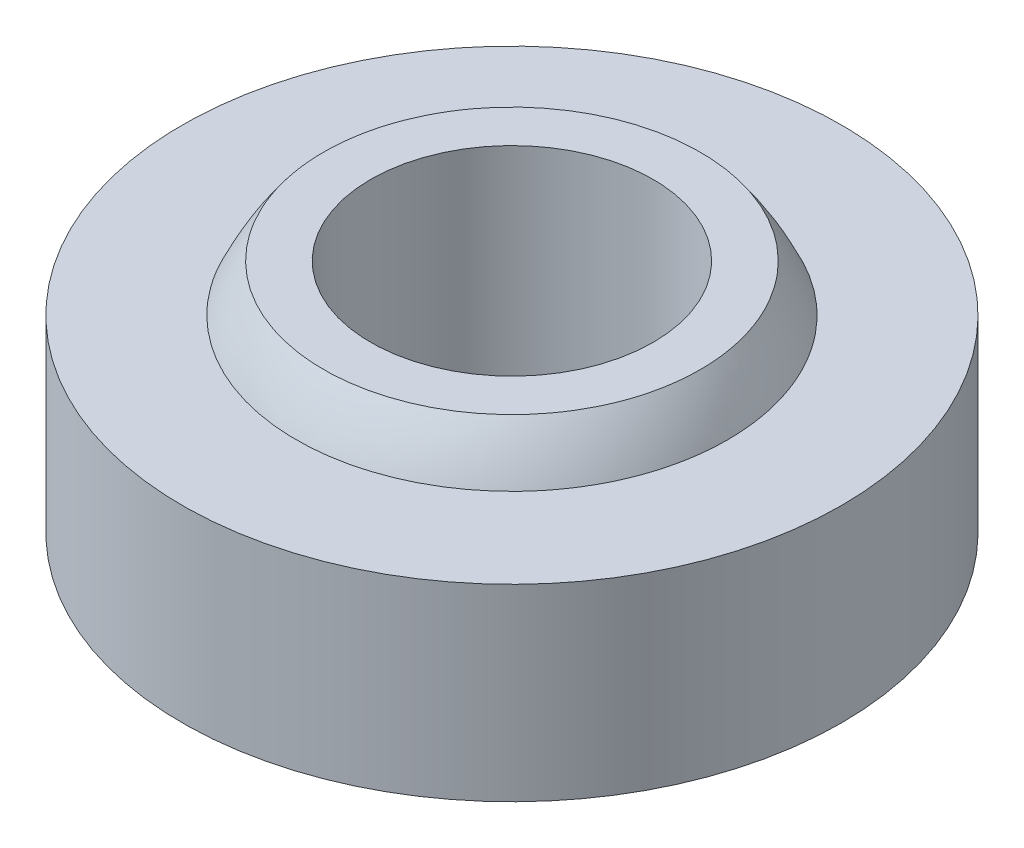
ISO-10303-21;
HEADER;
FILE_DESCRIPTION(('STEP AP214'),'2;1');
FILE_NAME('part.step','',(''),(''),'','','');
FILE_SCHEMA(('AUTOMOTIVE_DESIGN { 1 0 10303 214 1 1 1 1 }'));
ENDSEC;
DATA;
#1=APPLICATION_CONTEXT('core data for automotive mechanical design processes');
#2=APPLICATION_PROTOCOL_DEFINITION('international standard','automotive_design',2000,#1);
#3=PRODUCT_CONTEXT('',#1,'mechanical');
#4=PRODUCT('Part','Part','',(#3));
#5=PRODUCT_RELATED_PRODUCT_CATEGORY('part','',(#4));
#6=PRODUCT_DEFINITION_FORMATION('','',#4);
#7=PRODUCT_DEFINITION_CONTEXT('part definition',#1,'design');
#8=PRODUCT_DEFINITION('design','',#6,#7);
#9=PRODUCT_DEFINITION_SHAPE('','',#8);
#10=(LENGTH_UNIT() NAMED_UNIT(*) SI_UNIT(.MILLI.,.METRE.));
#11=(NAMED_UNIT(*) PLANE_ANGLE_UNIT() SI_UNIT($,.RADIAN.));
#12=(NAMED_UNIT(*) SI_UNIT($,.STERADIAN.) SOLID_ANGLE_UNIT());
#13=UNCERTAINTY_MEASURE_WITH_UNIT(LENGTH_MEASURE(1.E-05),#10,'distance_accuracy_value','');
#14=(GEOMETRIC_REPRESENTATION_CONTEXT(3) GLOBAL_UNCERTAINTY_ASSIGNED_CONTEXT((#13)) GLOBAL_UNIT_ASSIGNED_CONTEXT((#10,
#11,#12)) REPRESENTATION_CONTEXT('',''));
#15=CARTESIAN_POINT('',(0.,0.,0.));
#16=DIRECTION('',(0.,0.,1.));
#17=DIRECTION('',(1.,0.,0.));
#18=AXIS2_PLACEMENT_3D('',#15,#16,#17);
#19=CARTESIAN_POINT('',(0.,0.,0.));
#20=DIRECTION('',(0.,-1.,0.));
#21=DIRECTION('',(1.,0.,0.));
#22=AXIS2_PLACEMENT_3D('',#19,#20,#21);
#23=CYLINDRICAL_SURFACE('',#22,3.);
#24=CARTESIAN_POINT('',(0.,-3.,0.));
#25=DIRECTION('',(0.,-1.,0.));
#26=DIRECTION('',(1.,0.,0.));
#27=AXIS2_PLACEMENT_3D('',#24,#25,#26);
#28=CIRCLE('',#27,3.);
#29=CARTESIAN_POINT('',(3.,-3.,0.));
#30=VERTEX_POINT('',#29);
#31=EDGE_CURVE('E18',#30,#30,#28,.F.);
#32=ORIENTED_EDGE('',*,*,#31,.F.);
#33=EDGE_LOOP('',(#32));
#34=FACE_BOUND('',#33,.T.);
#35=CARTESIAN_POINT('',(0.,3.,0.));
#36=DIRECTION('',(0.,-1.,0.));
#37=DIRECTION('',(1.,0.,0.));
#38=AXIS2_PLACEMENT_3D('',#35,#36,#37);
#39=CIRCLE('',#38,3.);
#40=CARTESIAN_POINT('',(3.,3.,0.));
#41=VERTEX_POINT('',#40);
#42=EDGE_CURVE('E119',#41,#41,#39,.T.);
#43=ORIENTED_EDGE('',*,*,#42,.F.);
#44=EDGE_LOOP('',(#43));
#45=FACE_BOUND('',#44,.T.);
#46=ADVANCED_FACE('F15',(#34,#45),#23,.F.);
#47=CARTESIAN_POINT('',(3.5,-3.,0.));
#48=DIRECTION('',(0.,-1.,0.));
#49=DIRECTION('',(0.,0.,-1.));
#50=AXIS2_PLACEMENT_3D('',#47,#48,#49);
#51=PLANE('',#50);
#52=ORIENTED_EDGE('',*,*,#31,.T.);
#53=EDGE_LOOP('',(#52));
#54=FACE_BOUND('',#53,.T.);
#55=CARTESIAN_POINT('',(4.,-3.,0.));
#56=CARTESIAN_POINT('',(3.99999003661802,-3.,-0.224681767866029));
#57=CARTESIAN_POINT('',(3.98100576774657,-3.,-0.449526451187646));
#58=CARTESIAN_POINT('',(3.90553719844646,-3.,-0.893023453588219));
#59=CARTESIAN_POINT('',(3.84900776494289,-3.,-1.11166798922419));
#60=CARTESIAN_POINT('',(3.70005812836991,-3.,-1.53627539609878));
#61=CARTESIAN_POINT('',(3.60765506641119,-3.,-1.74224426964138));
#62=CARTESIAN_POINT('',(3.38960470170985,-3.,-2.13568761944987));
#63=CARTESIAN_POINT('',(3.26396566535881,-3.,-2.32316667857358));
#64=CARTESIAN_POINT('',(2.98298441438644,-3.,-2.67439419660804));
#65=CARTESIAN_POINT('',(2.82763909297667,-3.,-2.83814017027712));
#66=CARTESIAN_POINT('',(2.49165659254897,-3.,-3.13723374355396));
#67=CARTESIAN_POINT('',(2.31101842078934,-3.,-3.27258022796353));
#68=CARTESIAN_POINT('',(1.92958645723381,-3.,-3.51102281676963));
#69=CARTESIAN_POINT('',(1.72879304088476,-3.,-3.61411952175976));
#70=CARTESIAN_POINT('',(1.31274812032906,-3.,-3.78513904681603));
#71=CARTESIAN_POINT('',(1.09749664519565,-2.99999999999999,-3.85306193760967));
#72=CARTESIAN_POINT('',(0.658645177224154,-2.99999999999999,-3.95180615221405));
#73=CARTESIAN_POINT('',(0.43504516847158,-3.,-3.98262740529569));
#74=CARTESIAN_POINT('',(-0.0141552150189684,-3.,-4.00629315051678));
#75=CARTESIAN_POINT('',(-0.239755586151758,-3.,-3.99913771108644));
#76=CARTESIAN_POINT('',(-0.686553057770722,-3.,-3.94705334477137));
#77=CARTESIAN_POINT('',(-0.9077501566138,-3.,-3.90212440379159));
#78=CARTESIAN_POINT('',(-1.33946209637271,-3.,-3.77576834682869));
#79=CARTESIAN_POINT('',(-1.54997692601201,-3.,-3.69434119231781));
#80=CARTESIAN_POINT('',(-1.95434810659038,-3.,-3.49730021044113));
#81=CARTESIAN_POINT('',(-2.14820446295044,-3.,-3.38168639420039));
#82=CARTESIAN_POINT('',(-2.51375568569413,-3.,-3.11955406993029));
#83=CARTESIAN_POINT('',(-2.68545056104795,-3.,-2.97303557441012));
#84=CARTESIAN_POINT('',(-3.00180502498551,-3.,-2.65325306901473));
#85=CARTESIAN_POINT('',(-3.14646460986428,-3.,-2.47998905547426));
#86=CARTESIAN_POINT('',(-3.40464202073755,-3.,-2.11163395980966));
#87=CARTESIAN_POINT('',(-3.51815984266235,-3.,-1.91654287483311));
#88=CARTESIAN_POINT('',(-3.71083126079983,-3.,-1.51007172649937));
#89=CARTESIAN_POINT('',(-3.78998485848385,-3.,-1.29869166383962));
#90=CARTESIAN_POINT('',(-3.91168089449035,-3.,-0.865643021338417));
#91=CARTESIAN_POINT('',(-3.9542233344622,-3.,-0.643974441960473));
#92=CARTESIAN_POINT('',(-4.00148940636231,-3.,-0.196641276119343));
#93=CARTESIAN_POINT('',(-4.00621303829057,-3.,0.0290233103438434));
#94=CARTESIAN_POINT('',(-3.97770740343691,-3.,0.477942546658597));
#95=CARTESIAN_POINT('',(-3.94447813494518,-3.,0.701197196401595));
#96=CARTESIAN_POINT('',(-3.84100997549718,-3.,1.13895901494599));
#97=CARTESIAN_POINT('',(-3.7707710829563,-3.,1.35346618337285));
#98=CARTESIAN_POINT('',(-3.5952775618736,-3.,1.76764377335726));
#99=CARTESIAN_POINT('',(-3.49002293790773,-3.,1.96731419685372));
#100=CARTESIAN_POINT('',(-3.24748583733944,-3.,2.34615024642939));
#101=CARTESIAN_POINT('',(-3.11020336512616,-3.,2.5253158753186));
#102=CARTESIAN_POINT('',(-2.80750754285971,-3.,2.85805645153241));
#103=CARTESIAN_POINT('',(-2.64209418142014,-3.,3.01163138849873));
#104=CARTESIAN_POINT('',(-2.28783216212247,-3.,3.28883099510811));
#105=CARTESIAN_POINT('',(-2.09898349663805,-3.00000000000001,3.41245565500472));
#106=CARTESIAN_POINT('',(-1.70321198561587,-2.99999999999999,3.62624518497478));
#107=CARTESIAN_POINT('',(-1.49628915915757,-2.99999999999996,3.71641009036852));
#108=CARTESIAN_POINT('',(-1.07024315957484,-2.99999999999996,3.86072075559839));
#109=CARTESIAN_POINT('',(-0.851119991002951,-2.99999999999999,3.91486652887491));
#110=CARTESIAN_POINT('',(-0.406893084983804,-3.00000000000001,3.98560200790483));
#111=CARTESIAN_POINT('',(-0.18178933676085,-3.,4.00219164598567));
#112=CARTESIAN_POINT('',(0.268007871600364,-2.99999999999999,3.99734373828826));
#113=CARTESIAN_POINT('',(0.49270133251996,-3.,3.97590626500322));
#114=CARTESIAN_POINT('',(0.935300471262957,-3.,3.89561270203184));
#115=CARTESIAN_POINT('',(1.15320613543649,-3.,3.8367565371038));
#116=CARTESIAN_POINT('',(1.57604743444956,-3.,3.68329498873638));
#117=CARTESIAN_POINT('',(1.78098282765137,-3.,3.58868893950107));
#118=CARTESIAN_POINT('',(2.17205377570359,-3.,3.3664172144466));
#119=CARTESIAN_POINT('',(2.35819006830778,-3.,3.23875283667305));
#120=CARTESIAN_POINT('',(2.70636982413492,-3.,2.95400366555082));
#121=CARTESIAN_POINT('',(2.86841580614917,-3.,2.79692195185324));
#122=CARTESIAN_POINT('',(3.1638770460916,-3.,2.45773721347813));
#123=CARTESIAN_POINT('',(3.29728517794337,-3.,2.27562797954537));
#124=CARTESIAN_POINT('',(3.53168458834207,-3.,1.89152596104933));
#125=CARTESIAN_POINT('',(3.63266035871882,-3.,1.68952372439705));
#126=CARTESIAN_POINT('',(3.79914908224812,-3.,1.27159238909413));
#127=CARTESIAN_POINT('',(3.86470454516586,-3.,1.05568033439541));
#128=CARTESIAN_POINT('',(3.94101977883139,-3.,0.698660219581047));
#129=CARTESIAN_POINT('',(3.96310975859038,-3.,0.559871996412039));
#130=CARTESIAN_POINT('',(3.99260298223412,-3.,0.280743721667774));
#131=CARTESIAN_POINT('',(4.00000622611888,-3.,0.140403670092518));
#132=CARTESIAN_POINT('',(4.,-3.,0.));
#133=B_SPLINE_CURVE_WITH_KNOTS('',3,(#55,#56,#57,#58,#59,#60,#61,#62,#63,#64,#65,#66,#67,#68,
#69,#70,#71,#72,#73,#74,#75,#76,#77,#78,#79,#80,#81,#82,#83,#84,#85,#86,#87,#88,#89,#90,#91,#92,
#93,#94,#95,#96,#97,#98,#99,#100,#101,#102,#103,#104,#105,#106,#107,#108,#109,#110,#111,#112,
#113,#114,#115,#116,#117,#118,#119,#120,#121,#122,#123,#124,#125,#126,#127,#128,#129,#130,#131,
#132),.UNSPECIFIED.,.T.,.F.,(4,2,2,2,2,2,2,2,2,2,2,2,2,2,2,2,2,2,2,2,2,2,2,2,2,2,2,2,2,2,2,2,2,
2,2,2,2,2,4),(0.,0.673532830496009,1.34787678436072,2.02189891947999,2.69575357039147,
3.36967873398819,4.04363035649474,4.71756942712821,5.39150714259985,6.06544614283765,
6.73938392870499,7.41332196604992,8.08726071481011,8.76119924425646,9.43513750091524,
10.1090758499316,10.7830142870204,11.4569526952537,12.1308910731255,12.8048294509973,
13.4787678592306,14.1527062963194,14.8266446453357,15.5005829019945,16.1745214314409,
16.848460180201,17.5223982175459,18.1963360034133,18.8702750036511,19.5442127191228,
20.2181517897562,20.8921034122628,21.5660285758595,22.239883226771,22.9139053618903,
23.588249315755,24.261782146251,24.682672912011,25.103563677771),.UNSPECIFIED.);
#134=CARTESIAN_POINT('',(4.,-3.,0.));
#135=VERTEX_POINT('',#134);
#136=EDGE_CURVE('E120',#135,#135,#133,.T.);
#137=ORIENTED_EDGE('',*,*,#136,.F.);
#138=EDGE_LOOP('',(#137));
#139=FACE_BOUND('',#138,.T.);
#140=ADVANCED_FACE('F99',(#54,#139),#51,.T.);
#141=CARTESIAN_POINT('',(3.5,3.,0.));
#142=DIRECTION('',(0.,1.,0.));
#143=DIRECTION('',(0.,0.,1.));
#144=AXIS2_PLACEMENT_3D('',#141,#142,#143);
#145=PLANE('',#144);
#146=ORIENTED_EDGE('',*,*,#42,.T.);
#147=EDGE_LOOP('',(#146));
#148=FACE_BOUND('',#147,.T.);
#149=CARTESIAN_POINT('',(4.,3.,0.));
#150=CARTESIAN_POINT('',(3.99999003661802,3.,0.22468176786603));
#151=CARTESIAN_POINT('',(3.98100576774657,3.,0.449526451187646));
#152=CARTESIAN_POINT('',(3.90553719844646,3.,0.893023453588219));
#153=CARTESIAN_POINT('',(3.84900776494289,3.,1.11166798922419));
#154=CARTESIAN_POINT('',(3.70005812836991,3.,1.53627539609878));
#155=CARTESIAN_POINT('',(3.60765506641119,3.,1.74224426964138));
#156=CARTESIAN_POINT('',(3.38960470170985,3.,2.13568761944987));
#157=CARTESIAN_POINT('',(3.26396566535881,3.,2.32316667857358));
#158=CARTESIAN_POINT('',(2.98298441438643,3.,2.67439419660804));
#159=CARTESIAN_POINT('',(2.82763909297667,3.,2.83814017027712));
#160=CARTESIAN_POINT('',(2.49165659254897,3.,3.13723374355396));
#161=CARTESIAN_POINT('',(2.31101842078934,3.,3.27258022796353));
#162=CARTESIAN_POINT('',(1.92958645723381,3.,3.51102281676963));
#163=CARTESIAN_POINT('',(1.72879304088476,3.,3.61411952175976));
#164=CARTESIAN_POINT('',(1.31274812032905,3.,3.78513904681603));
#165=CARTESIAN_POINT('',(1.09749664519565,2.99999999999998,3.85306193760968));
#166=CARTESIAN_POINT('',(0.658645177224153,2.99999999999998,3.95180615221405));
#167=CARTESIAN_POINT('',(0.435045168471579,3.,3.98262740529569));
#168=CARTESIAN_POINT('',(-0.014155215018969,3.,4.00629315051678));
#169=CARTESIAN_POINT('',(-0.239755586151758,3.,3.99913771108644));
#170=CARTESIAN_POINT('',(-0.686553057770722,3.,3.94705334477138));
#171=CARTESIAN_POINT('',(-0.907750156613799,3.,3.90212440379159));
#172=CARTESIAN_POINT('',(-1.33946209637271,3.,3.77576834682869));
#173=CARTESIAN_POINT('',(-1.54997692601201,3.,3.69434119231781));
#174=CARTESIAN_POINT('',(-1.95434810659038,3.,3.49730021044113));
#175=CARTESIAN_POINT('',(-2.14820446295044,3.,3.38168639420039));
#176=CARTESIAN_POINT('',(-2.51375568569413,3.,3.11955406993029));
#177=CARTESIAN_POINT('',(-2.68545056104795,3.,2.97303557441012));
#178=CARTESIAN_POINT('',(-3.00180502498551,3.,2.65325306901473));
#179=CARTESIAN_POINT('',(-3.14646460986428,3.,2.47998905547426));
#180=CARTESIAN_POINT('',(-3.40464202073755,3.,2.11163395980966));
#181=CARTESIAN_POINT('',(-3.51815984266235,3.,1.91654287483311));
#182=CARTESIAN_POINT('',(-3.71083126079983,3.,1.51007172649937));
#183=CARTESIAN_POINT('',(-3.78998485848385,3.,1.29869166383962));
#184=CARTESIAN_POINT('',(-3.91168089449035,3.,0.865643021338417));
#185=CARTESIAN_POINT('',(-3.9542233344622,3.,0.643974441960473));
#186=CARTESIAN_POINT('',(-4.00148940636231,3.,0.196641276119343));
#187=CARTESIAN_POINT('',(-4.00621303829057,3.,-0.0290233103438435));
#188=CARTESIAN_POINT('',(-3.97770740343691,3.,-0.477942546658598));
#189=CARTESIAN_POINT('',(-3.94447813494518,3.,-0.701197196401595));
#190=CARTESIAN_POINT('',(-3.84100997549718,3.,-1.13895901494599));
#191=CARTESIAN_POINT('',(-3.7707710829563,3.,-1.35346618337285));
#192=CARTESIAN_POINT('',(-3.5952775618736,3.,-1.76764377335726));
#193=CARTESIAN_POINT('',(-3.49002293790773,3.,-1.96731419685372));
#194=CARTESIAN_POINT('',(-3.24748583733944,3.,-2.34615024642939));
#195=CARTESIAN_POINT('',(-3.11020336512615,3.,-2.52531587531861));
#196=CARTESIAN_POINT('',(-2.80750754285971,3.,-2.85805645153241));
#197=CARTESIAN_POINT('',(-2.64209418142014,3.,-3.01163138849873));
#198=CARTESIAN_POINT('',(-2.28783216212247,3.,-3.28883099510811));
#199=CARTESIAN_POINT('',(-2.09898349663805,3.00000000000001,-3.41245565500472));
#200=CARTESIAN_POINT('',(-1.70321198561587,2.99999999999999,-3.62624518497478));
#201=CARTESIAN_POINT('',(-1.49628915915757,2.99999999999996,-3.71641009036852));
#202=CARTESIAN_POINT('',(-1.07024315957484,2.99999999999996,-3.86072075559839));
#203=CARTESIAN_POINT('',(-0.85111999100295,2.99999999999999,-3.91486652887491));
#204=CARTESIAN_POINT('',(-0.406893084983804,3.00000000000001,-3.98560200790483));
#205=CARTESIAN_POINT('',(-0.181789336760851,3.,-4.00219164598567));
#206=CARTESIAN_POINT('',(0.268007871600364,2.99999999999999,-3.99734373828826));
#207=CARTESIAN_POINT('',(0.492701332519961,3.,-3.97590626500322));
#208=CARTESIAN_POINT('',(0.935300471262957,3.,-3.89561270203184));
#209=CARTESIAN_POINT('',(1.15320613543649,3.,-3.83675653710379));
#210=CARTESIAN_POINT('',(1.57604743444956,3.,-3.68329498873638));
#211=CARTESIAN_POINT('',(1.78098282765137,3.,-3.58868893950107));
#212=CARTESIAN_POINT('',(2.17205377570359,3.,-3.3664172144466));
#213=CARTESIAN_POINT('',(2.35819006830778,3.,-3.23875283667305));
#214=CARTESIAN_POINT('',(2.70636982413492,3.,-2.95400366555082));
#215=CARTESIAN_POINT('',(2.86841580614917,3.,-2.79692195185325));
#216=CARTESIAN_POINT('',(3.1638770460916,3.,-2.45773721347813));
#217=CARTESIAN_POINT('',(3.29728517794337,3.,-2.27562797954537));
#218=CARTESIAN_POINT('',(3.53168458834207,3.,-1.89152596104933));
#219=CARTESIAN_POINT('',(3.63266035871882,3.,-1.68952372439705));
#220=CARTESIAN_POINT('',(3.79914908224812,3.,-1.27159238909412));
#221=CARTESIAN_POINT('',(3.86470454516586,3.,-1.05568033439541));
#222=CARTESIAN_POINT('',(3.94101977883139,3.,-0.698660219581046));
#223=CARTESIAN_POINT('',(3.96310975859038,3.,-0.559871996412038));
#224=CARTESIAN_POINT('',(3.99260298223412,3.,-0.280743721667774));
#225=CARTESIAN_POINT('',(4.00000622611888,3.,-0.140403670092517));
#226=CARTESIAN_POINT('',(4.,3.,0.));
#227=B_SPLINE_CURVE_WITH_KNOTS('',3,(#149,#150,#151,#152,#153,#154,#155,#156,#157,#158,#159,
#160,#161,#162,#163,#164,#165,#166,#167,#168,#169,#170,#171,#172,#173,#174,#175,#176,#177,#178,
#179,#180,#181,#182,#183,#184,#185,#186,#187,#188,#189,#190,#191,#192,#193,#194,#195,#196,#197,
#198,#199,#200,#201,#202,#203,#204,#205,#206,#207,#208,#209,#210,#211,#212,#213,#214,#215,#216,
#217,#218,#219,#220,#221,#222,#223,#224,#225,#226),.UNSPECIFIED.,.T.,.F.,(4,2,2,2,2,2,2,2,2,2,2,
2,2,2,2,2,2,2,2,2,2,2,2,2,2,2,2,2,2,2,2,2,2,2,2,2,2,2,4),(0.,0.673532830496009,1.34787678436072,
2.02189891947999,2.69575357039147,3.36967873398819,4.04363035649474,4.71756942712821,
5.39150714259985,6.06544614283765,6.73938392870499,7.41332196604992,8.08726071481011,
8.76119924425646,9.43513750091524,10.1090758499316,10.7830142870204,11.4569526952537,
12.1308910731255,12.8048294509973,13.4787678592306,14.1527062963194,14.8266446453357,
15.5005829019945,16.1745214314409,16.848460180201,17.5223982175459,18.1963360034133,
18.8702750036511,19.5442127191228,20.2181517897562,20.8921034122628,21.5660285758595,
22.239883226771,22.9139053618903,23.588249315755,24.261782146251,24.682672912011,
25.1035636777709),.UNSPECIFIED.);
#228=CARTESIAN_POINT('',(4.,3.,0.));
#229=VERTEX_POINT('',#228);
#230=EDGE_CURVE('E122',#229,#229,#227,.T.);
#231=ORIENTED_EDGE('',*,*,#230,.F.);
#232=EDGE_LOOP('',(#231));
#233=FACE_BOUND('',#232,.T.);
#234=ADVANCED_FACE('F92',(#148,#233),#145,.T.);
#235=CARTESIAN_POINT('',(0.,0.,0.));
#236=DIRECTION('',(1.,0.,0.));
#237=DIRECTION('',(0.,1.,0.));
#238=AXIS2_PLACEMENT_3D('',#235,#236,#237);
#239=SPHERICAL_SURFACE('',#238,5.);
#240=CARTESIAN_POINT('',(4.58257569495584,-2.,0.));
#241=CARTESIAN_POINT('',(4.58256428046782,-2.,-0.257405302130648));
#242=CARTESIAN_POINT('',(4.56081506818861,-2.00000000000001,-0.514997247363071));
#243=CARTESIAN_POINT('',(4.47435496033666,-1.99999999999999,-1.02308689335974));
#244=CARTESIAN_POINT('',(4.40959235833091,-1.99999999999997,-1.27357567706982));
#245=CARTESIAN_POINT('',(4.23894911224795,-1.99999999999997,-1.76002457273026));
#246=CARTESIAN_POINT('',(4.13308810578004,-1.99999999999999,-1.9959915611837));
#247=CARTESIAN_POINT('',(3.88328003039088,-2.00000000000001,-2.44673754422729));
#248=CARTESIAN_POINT('',(3.73934243181089,-2.,-2.66152178914067));
#249=CARTESIAN_POINT('',(3.41743796894981,-2.,-3.06390346102677));
#250=CARTESIAN_POINT('',(3.23946754539544,-2.,-3.25149804079747));
#251=CARTESIAN_POINT('',(2.85455123529782,-2.,-3.59415277565145));
#252=CARTESIAN_POINT('',(2.64760421142609,-2.,-3.7492116531147));
#253=CARTESIAN_POINT('',(2.21061900005887,-2.,-4.02238195614099));
#254=CARTESIAN_POINT('',(1.98058124269178,-2.,-4.14049406977044));
#255=CARTESIAN_POINT('',(1.50394190745467,-2.,-4.33642154949188));
#256=CARTESIAN_POINT('',(1.25734036289224,-2.,-4.41423699661239));
#257=CARTESIAN_POINT('',(0.754572845186762,-2.,-4.52736270607826));
#258=CARTESIAN_POINT('',(0.498406853811401,-2.,-4.56267288739327));
#259=CARTESIAN_POINT('',(-0.016216836075748,-2.,-4.58978540460656));
#260=CARTESIAN_POINT('',(-0.274674530457279,-2.,-4.58158781890151));
#261=CARTESIAN_POINT('',(-0.786545338959471,-2.,-4.52191768111085));
#262=CARTESIAN_POINT('',(-1.03995845119773,-2.,-4.47044511287734));
#263=CARTESIAN_POINT('',(-1.53454661178809,-2.,-4.32568606399018));
#264=CARTESIAN_POINT('',(-1.77572164722129,-2.,-4.23239953919743));
#265=CARTESIAN_POINT('',(-2.23898703318604,-2.,-4.00666073558284));
#266=CARTESIAN_POINT('',(-2.46107738992812,-2.,-3.87420846950637));
#267=CARTESIAN_POINT('',(-2.87986892707977,-2.,-3.57389816499076));
#268=CARTESIAN_POINT('',(-3.076570117766,-2.,-3.4060401408827));
#269=CARTESIAN_POINT('',(-3.43899968712375,-2.,-3.03968325665844));
#270=CARTESIAN_POINT('',(-3.60472806155071,-2.,-2.84118439234317));
#271=CARTESIAN_POINT('',(-3.90050744356433,-2.,-2.41918061521674));
#272=CARTESIAN_POINT('',(-4.03055844648856,-2.,-2.19567569913771));
#273=CARTESIAN_POINT('',(-4.25129128595592,-2.,-1.73000449787397));
#274=CARTESIAN_POINT('',(-4.34197312418469,-2.00000000000001,-1.48783821348827));
#275=CARTESIAN_POINT('',(-4.48139344837865,-1.99999999999999,-0.99171866752337));
#276=CARTESIAN_POINT('',(-4.53013193623344,-1.99999999999998,-0.737765406475186));
#277=CARTESIAN_POINT('',(-4.58428202430481,-1.99999999999998,-0.225280883142384));
#278=CARTESIAN_POINT('',(-4.5896936245214,-1.99999999999999,0.0332503791422353));
#279=CARTESIAN_POINT('',(-4.55703631715897,-2.00000000000001,0.547551974475777));
#280=CARTESIAN_POINT('',(-4.51896740762112,-2.,0.803322307400316));
#281=CARTESIAN_POINT('',(-4.40042973944906,-2.,1.30484147486062));
#282=CARTESIAN_POINT('',(-4.31996097899945,-2.,1.55059030896731));
#283=CARTESIAN_POINT('',(-4.11890789291549,-2.,2.02509034828179));
#284=CARTESIAN_POINT('',(-3.99832357252357,-2.,2.25384155571089));
#285=CARTESIAN_POINT('',(-3.72046241697623,-2.,2.68785277400053));
#286=CARTESIAN_POINT('',(-3.56318558684922,-2.,2.89311278808032));
#287=CARTESIAN_POINT('',(-3.2164039573285,-2.,3.27431500740107));
#288=CARTESIAN_POINT('',(-3.02689914489002,-2.,3.45025720077512));
#289=CARTESIAN_POINT('',(-2.62104101507014,-2.,3.76782924575));
#290=CARTESIAN_POINT('',(-2.4046876889517,-2.,3.90945908618485));
#291=CARTESIAN_POINT('',(-1.95127446216012,-2.,4.15438576215404));
#292=CARTESIAN_POINT('',(-1.71421458334526,-2.,4.25768263815286));
#293=CARTESIAN_POINT('',(-1.22611757269,-2.,4.42301127490417));
#294=CARTESIAN_POINT('',(-0.975080446065204,-2.,4.48504305105458));
#295=CARTESIAN_POINT('',(-0.466154590423033,-2.,4.56608072279798));
#296=CARTESIAN_POINT('',(-0.20826584906055,-2.,4.5850865408623));
#297=CARTESIAN_POINT('',(0.307041589613213,-2.,4.57953256486591));
#298=CARTESIAN_POINT('',(0.564460287819625,-2.,4.5549728538566));
#299=CARTESIAN_POINT('',(1.07152130177263,-2.,4.46298502132308));
#300=CARTESIAN_POINT('',(1.32116360188135,-2.,4.39555681359868));
#301=CARTESIAN_POINT('',(1.80558916680155,-2.,4.21974452318397));
#302=CARTESIAN_POINT('',(2.04037215478226,-2.,4.11135967772859));
#303=CARTESIAN_POINT('',(2.48840021016912,-2.,3.85671542650095));
#304=CARTESIAN_POINT('',(2.7016461227784,-2.,3.71045750782677));
#305=CARTESIAN_POINT('',(3.10053614441068,-2.,3.38423635014088));
#306=CARTESIAN_POINT('',(3.28618313907162,-2.,3.20427663931275));
#307=CARTESIAN_POINT('',(3.62467651331203,-2.,2.81569170476831));
#308=CARTESIAN_POINT('',(3.77751472894538,-2.,2.60705936745648));
#309=CARTESIAN_POINT('',(4.04605298919664,-2.,2.16701522387062));
#310=CARTESIAN_POINT('',(4.16173526697362,-2.,1.93559258886826));
#311=CARTESIAN_POINT('',(4.35247206145602,-2.,1.45679209403835));
#312=CARTESIAN_POINT('',(4.42757527921562,-2.,1.20943376051077));
#313=CARTESIAN_POINT('',(4.51500536295325,-2.,0.800415835321119));
#314=CARTESIAN_POINT('',(4.54031261403964,-2.,0.641413950761025));
#315=CARTESIAN_POINT('',(4.57410134649857,-2.,0.321632338856533));
#316=CARTESIAN_POINT('',(4.5825828278711,-2.,0.160852611512135));
#317=CARTESIAN_POINT('',(4.58257569495584,-2.,0.));
#318=B_SPLINE_CURVE_WITH_KNOTS('',3,(#240,#241,#242,#243,#244,#245,#246,#247,#248,#249,#250,
#251,#252,#253,#254,#255,#256,#257,#258,#259,#260,#261,#262,#263,#264,#265,#266,#267,#268,#269,
#270,#271,#272,#273,#274,#275,#276,#277,#278,#279,#280,#281,#282,#283,#284,#285,#286,#287,#288,
#289,#290,#291,#292,#293,#294,#295,#296,#297,#298,#299,#300,#301,#302,#303,#304,#305,#306,#307,
#308,#309,#310,#311,#312,#313,#314,#315,#316,#317),.UNSPECIFIED.,.T.,.F.,(4,2,2,2,2,2,2,2,2,2,2,
2,2,2,2,2,2,2,2,2,2,2,2,2,2,2,2,2,2,2,2,2,2,2,2,2,2,2,4),(0.,0.771628794696467,1.54418684795169,
2.31637621151665,3.08837369781664,3.860451966546,4.63256054776465,5.40465474900617,
6.17674739771478,6.94884151830792,7.72093424766491,8.49302726512569,9.26512109761504,
10.0372146788488,10.8093079475652,11.5814013220904,12.3534947975153,13.1255882398821,
13.8976816474654,14.6697750550487,15.4418684974156,16.2139619728405,16.9860553473657,
17.7581486160821,18.5302421973159,19.3023360298052,20.074429047266,20.846521776623,
21.6186158972161,22.3907085459247,23.1628027471662,23.9349113283849,24.7069895971143,
25.4789870834142,26.2511764469792,27.0237345002344,27.7953632949309,28.2775542432816,
28.7597451916323),.UNSPECIFIED.);
#319=CARTESIAN_POINT('',(4.58257569495584,-2.,0.));
#320=VERTEX_POINT('',#319);
#321=EDGE_CURVE('E39',#320,#320,#318,.T.);
#322=ORIENTED_EDGE('',*,*,#321,.F.);
#323=EDGE_LOOP('',(#322));
#324=FACE_BOUND('',#323,.T.);
#325=ORIENTED_EDGE('',*,*,#136,.T.);
#326=EDGE_LOOP('',(#325));
#327=FACE_BOUND('',#326,.T.);
#328=ADVANCED_FACE('F61',(#324,#327),#239,.T.);
#329=CARTESIAN_POINT('',(0.,0.,0.));
#330=DIRECTION('',(1.,0.,0.));
#331=DIRECTION('',(0.,1.,0.));
#332=AXIS2_PLACEMENT_3D('',#329,#330,#331);
#333=SPHERICAL_SURFACE('',#332,5.00000000000001);
#334=ORIENTED_EDGE('',*,*,#230,.T.);
#335=EDGE_LOOP('',(#334));
#336=FACE_BOUND('',#335,.T.);
#337=CARTESIAN_POINT('',(4.58257569495584,2.,0.));
#338=CARTESIAN_POINT('',(4.58256428046782,2.,0.257405302130648));
#339=CARTESIAN_POINT('',(4.56081506818861,2.00000000000001,0.514997247363072));
#340=CARTESIAN_POINT('',(4.47435496033666,1.99999999999999,1.02308689335974));
#341=CARTESIAN_POINT('',(4.40959235833091,1.99999999999997,1.27357567706982));
#342=CARTESIAN_POINT('',(4.23894911224794,1.99999999999997,1.76002457273026));
#343=CARTESIAN_POINT('',(4.13308810578004,1.99999999999999,1.9959915611837));
#344=CARTESIAN_POINT('',(3.88328003039088,2.00000000000001,2.4467375442273));
#345=CARTESIAN_POINT('',(3.73934243181089,2.,2.66152178914067));
#346=CARTESIAN_POINT('',(3.41743796894981,2.,3.06390346102677));
#347=CARTESIAN_POINT('',(3.23946754539544,2.,3.25149804079747));
#348=CARTESIAN_POINT('',(2.85455123529782,2.,3.59415277565145));
#349=CARTESIAN_POINT('',(2.64760421142608,2.,3.7492116531147));
#350=CARTESIAN_POINT('',(2.21061900005886,2.,4.02238195614099));
#351=CARTESIAN_POINT('',(1.98058124269178,2.,4.14049406977044));
#352=CARTESIAN_POINT('',(1.50394190745467,2.,4.33642154949188));
#353=CARTESIAN_POINT('',(1.25734036289223,2.,4.41423699661239));
#354=CARTESIAN_POINT('',(0.754572845186758,2.,4.52736270607827));
#355=CARTESIAN_POINT('',(0.498406853811398,2.,4.56267288739327));
#356=CARTESIAN_POINT('',(-0.0162168360757512,2.,4.58978540460656));
#357=CARTESIAN_POINT('',(-0.274674530457282,2.,4.58158781890151));
#358=CARTESIAN_POINT('',(-0.786545338959474,2.,4.52191768111085));
#359=CARTESIAN_POINT('',(-1.03995845119773,2.,4.47044511287734));
#360=CARTESIAN_POINT('',(-1.53454661178809,2.,4.32568606399018));
#361=CARTESIAN_POINT('',(-1.77572164722129,2.,4.23239953919743));
#362=CARTESIAN_POINT('',(-2.23898703318604,2.,4.00666073558284));
#363=CARTESIAN_POINT('',(-2.46107738992812,2.,3.87420846950637));
#364=CARTESIAN_POINT('',(-2.87986892707978,2.,3.57389816499076));
#365=CARTESIAN_POINT('',(-3.076570117766,2.,3.4060401408827));
#366=CARTESIAN_POINT('',(-3.43899968712375,2.,3.03968325665844));
#367=CARTESIAN_POINT('',(-3.60472806155071,2.,2.84118439234317));
#368=CARTESIAN_POINT('',(-3.90050744356433,2.,2.41918061521674));
#369=CARTESIAN_POINT('',(-4.03055844648856,2.,2.19567569913771));
#370=CARTESIAN_POINT('',(-4.25129128595592,2.,1.73000449787397));
#371=CARTESIAN_POINT('',(-4.34197312418469,2.00000000000001,1.48783821348827));
#372=CARTESIAN_POINT('',(-4.48139344837865,1.99999999999999,0.991718667523367));
#373=CARTESIAN_POINT('',(-4.53013193623344,1.99999999999998,0.737765406475184));
#374=CARTESIAN_POINT('',(-4.58428202430481,1.99999999999998,0.225280883142381));
#375=CARTESIAN_POINT('',(-4.5896936245214,1.99999999999999,-0.0332503791422381));
#376=CARTESIAN_POINT('',(-4.55703631715897,2.00000000000001,-0.54755197447578));
#377=CARTESIAN_POINT('',(-4.51896740762112,2.,-0.803322307400319));
#378=CARTESIAN_POINT('',(-4.40042973944906,2.,-1.30484147486063));
#379=CARTESIAN_POINT('',(-4.31996097899945,2.,-1.55059030896731));
#380=CARTESIAN_POINT('',(-4.11890789291549,2.,-2.0250903482818));
#381=CARTESIAN_POINT('',(-3.99832357252357,2.,-2.2538415557109));
#382=CARTESIAN_POINT('',(-3.72046241697623,2.,-2.68785277400053));
#383=CARTESIAN_POINT('',(-3.56318558684922,2.,-2.89311278808033));
#384=CARTESIAN_POINT('',(-3.21640395732849,2.,-3.27431500740107));
#385=CARTESIAN_POINT('',(-3.02689914489001,2.,-3.45025720077512));
#386=CARTESIAN_POINT('',(-2.62104101507014,2.,-3.76782924575));
#387=CARTESIAN_POINT('',(-2.40468768895169,2.,-3.90945908618485));
#388=CARTESIAN_POINT('',(-1.95127446216012,2.,-4.15438576215404));
#389=CARTESIAN_POINT('',(-1.71421458334525,2.,-4.25768263815286));
#390=CARTESIAN_POINT('',(-1.22611757269,2.,-4.42301127490417));
#391=CARTESIAN_POINT('',(-0.975080446065202,2.,-4.48504305105459));
#392=CARTESIAN_POINT('',(-0.46615459042303,2.,-4.56608072279798));
#393=CARTESIAN_POINT('',(-0.208265849060546,2.,-4.5850865408623));
#394=CARTESIAN_POINT('',(0.307041589613216,2.,-4.57953256486591));
#395=CARTESIAN_POINT('',(0.564460287819628,2.,-4.5549728538566));
#396=CARTESIAN_POINT('',(1.07152130177264,2.,-4.46298502132308));
#397=CARTESIAN_POINT('',(1.32116360188135,2.,-4.39555681359868));
#398=CARTESIAN_POINT('',(1.80558916680156,2.,-4.21974452318397));
#399=CARTESIAN_POINT('',(2.04037215478226,2.,-4.11135967772859));
#400=CARTESIAN_POINT('',(2.48840021016912,2.,-3.85671542650095));
#401=CARTESIAN_POINT('',(2.7016461227784,2.,-3.71045750782677));
#402=CARTESIAN_POINT('',(3.10053614441068,2.,-3.38423635014088));
#403=CARTESIAN_POINT('',(3.28618313907162,2.,-3.20427663931275));
#404=CARTESIAN_POINT('',(3.62467651331203,2.,-2.81569170476831));
#405=CARTESIAN_POINT('',(3.77751472894538,2.,-2.60705936745648));
#406=CARTESIAN_POINT('',(4.04605298919664,2.,-2.16701522387062));
#407=CARTESIAN_POINT('',(4.16173526697362,2.,-1.93559258886826));
#408=CARTESIAN_POINT('',(4.35247206145601,2.,-1.45679209403835));
#409=CARTESIAN_POINT('',(4.42757527921562,2.,-1.20943376051077));
#410=CARTESIAN_POINT('',(4.51500536295325,2.,-0.800415835321119));
#411=CARTESIAN_POINT('',(4.54031261403964,2.,-0.641413950761025));
#412=CARTESIAN_POINT('',(4.57410134649857,2.,-0.321632338856533));
#413=CARTESIAN_POINT('',(4.5825828278711,2.,-0.160852611512135));
#414=CARTESIAN_POINT('',(4.58257569495584,2.,0.));
#415=B_SPLINE_CURVE_WITH_KNOTS('',3,(#337,#338,#339,#340,#341,#342,#343,#344,#345,#346,#347,
#348,#349,#350,#351,#352,#353,#354,#355,#356,#357,#358,#359,#360,#361,#362,#363,#364,#365,#366,
#367,#368,#369,#370,#371,#372,#373,#374,#375,#376,#377,#378,#379,#380,#381,#382,#383,#384,#385,
#386,#387,#388,#389,#390,#391,#392,#393,#394,#395,#396,#397,#398,#399,#400,#401,#402,#403,#404,
#405,#406,#407,#408,#409,#410,#411,#412,#413,#414),.UNSPECIFIED.,.T.,.F.,(4,2,2,2,2,2,2,2,2,2,2,
2,2,2,2,2,2,2,2,2,2,2,2,2,2,2,2,2,2,2,2,2,2,2,2,2,2,2,4),(0.,0.771628794696468,1.54418684795169,
2.31637621151665,3.08837369781664,3.860451966546,4.63256054776465,5.40465474900617,
6.17674739771478,6.94884151830792,7.72093424766491,8.4930272651257,9.26512109761504,
10.0372146788488,10.8093079475652,11.5814013220904,12.3534947975153,13.1255882398821,
13.8976816474654,14.6697750550487,15.4418684974156,16.2139619728405,16.9860553473657,
17.7581486160821,18.5302421973159,19.3023360298052,20.074429047266,20.846521776623,
21.6186158972161,22.3907085459247,23.1628027471662,23.9349113283849,24.7069895971143,
25.4789870834142,26.2511764469792,27.0237345002344,27.7953632949308,28.2775542432816,
28.7597451916323),.UNSPECIFIED.);
#416=CARTESIAN_POINT('',(4.58257569495584,2.,0.));
#417=VERTEX_POINT('',#416);
#418=EDGE_CURVE('E27',#417,#417,#415,.T.);
#419=ORIENTED_EDGE('',*,*,#418,.F.);
#420=EDGE_LOOP('',(#419));
#421=FACE_BOUND('',#420,.T.);
#422=ADVANCED_FACE('F45',(#336,#421),#333,.T.);
#423=CARTESIAN_POINT('',(5.79128784747792,-2.,0.));
#424=DIRECTION('',(0.,-1.,0.));
#425=DIRECTION('',(0.,0.,-1.));
#426=AXIS2_PLACEMENT_3D('',#423,#424,#425);
#427=PLANE('',#426);
#428=ORIENTED_EDGE('',*,*,#321,.T.);
#429=EDGE_LOOP('',(#428));
#430=FACE_BOUND('',#429,.T.);
#431=CARTESIAN_POINT('',(0.,-2.,0.));
#432=DIRECTION('',(0.,-1.,0.));
#433=DIRECTION('',(1.,0.,0.));
#434=AXIS2_PLACEMENT_3D('',#431,#432,#433);
#435=CIRCLE('',#434,7.);
#436=CARTESIAN_POINT('',(7.,-2.,0.));
#437=VERTEX_POINT('',#436);
#438=EDGE_CURVE('E22',#437,#437,#435,.F.);
#439=ORIENTED_EDGE('',*,*,#438,.F.);
#440=EDGE_LOOP('',(#439));
#441=FACE_BOUND('',#440,.T.);
#442=ADVANCED_FACE('F52',(#430,#441),#427,.T.);
#443=CARTESIAN_POINT('',(5.79128784747792,2.,0.));
#444=DIRECTION('',(0.,1.,0.));
#445=DIRECTION('',(0.,0.,1.));
#446=AXIS2_PLACEMENT_3D('',#443,#444,#445);
#447=PLANE('',#446);
#448=ORIENTED_EDGE('',*,*,#418,.T.);
#449=EDGE_LOOP('',(#448));
#450=FACE_BOUND('',#449,.T.);
#451=CARTESIAN_POINT('',(0.,2.,0.));
#452=DIRECTION('',(0.,-1.,0.));
#453=DIRECTION('',(1.,0.,0.));
#454=AXIS2_PLACEMENT_3D('',#451,#452,#453);
#455=CIRCLE('',#454,7.);
#456=CARTESIAN_POINT('',(7.,2.,0.));
#457=VERTEX_POINT('',#456);
#458=EDGE_CURVE('E10',#457,#457,#455,.T.);
#459=ORIENTED_EDGE('',*,*,#458,.F.);
#460=EDGE_LOOP('',(#459));
#461=FACE_BOUND('',#460,.T.);
#462=ADVANCED_FACE('F47',(#450,#461),#447,.T.);
#463=CARTESIAN_POINT('',(0.,0.,0.));
#464=DIRECTION('',(0.,-1.,0.));
#465=DIRECTION('',(1.,0.,0.));
#466=AXIS2_PLACEMENT_3D('',#463,#464,#465);
#467=CYLINDRICAL_SURFACE('',#466,7.);
#468=ORIENTED_EDGE('',*,*,#458,.T.);
#469=EDGE_LOOP('',(#468));
#470=FACE_BOUND('',#469,.T.);
#471=ORIENTED_EDGE('',*,*,#438,.T.);
#472=EDGE_LOOP('',(#471));
#473=FACE_BOUND('',#472,.T.);
#474=ADVANCED_FACE('F51',(#470,#473),#467,.T.);
#475=CLOSED_SHELL('',(#46,#140,#234,#328,#422,#442,#462,#474));
#476=MANIFOLD_SOLID_BREP('B1',#475);
#477=ADVANCED_BREP_SHAPE_REPRESENTATION('',(#18,#476),#14);
#478=SHAPE_DEFINITION_REPRESENTATION(#9,#477);
ENDSEC;
END-ISO-10303-21;
